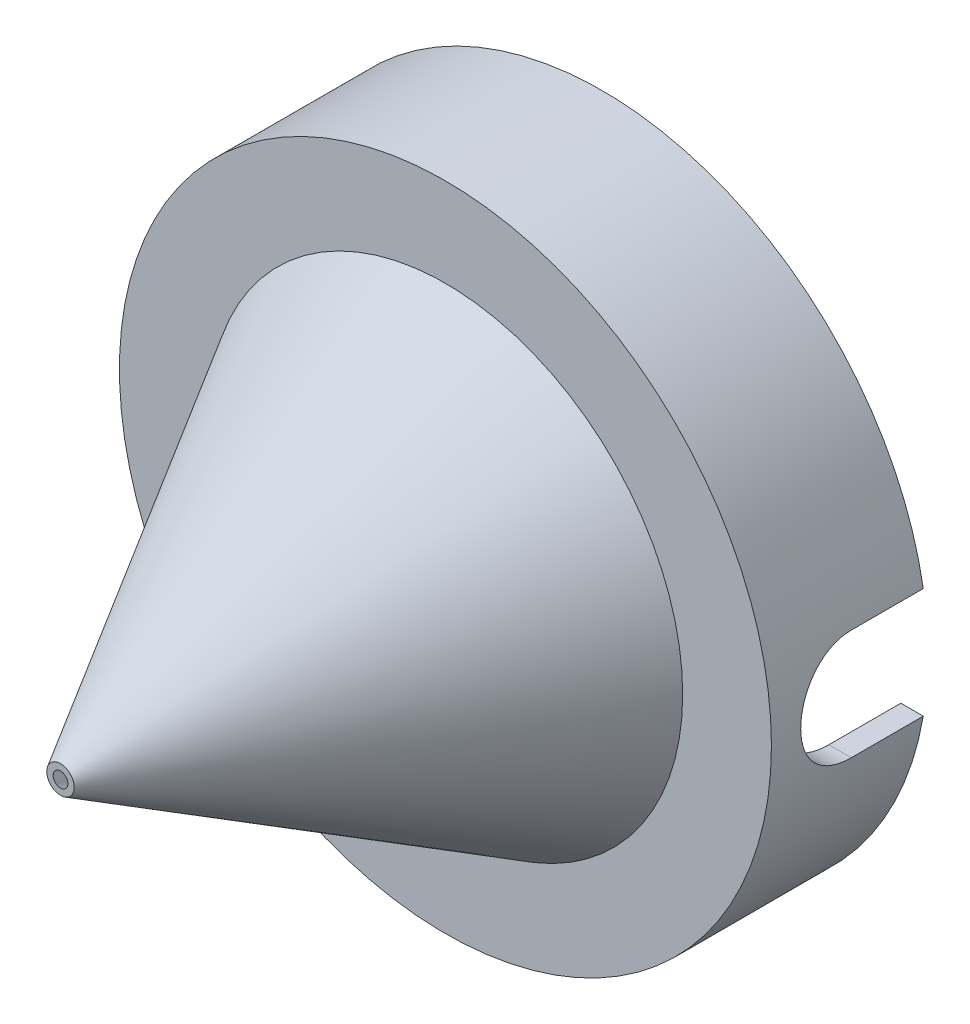
ISO-10303-21;
HEADER;
FILE_DESCRIPTION(('STEP AP214'),'2;1');
FILE_NAME('part.step','',(''),(''),'','','');
FILE_SCHEMA(('AUTOMOTIVE_DESIGN { 1 0 10303 214 1 1 1 1 }'));
ENDSEC;
DATA;
#1=APPLICATION_CONTEXT('core data for automotive mechanical design processes');
#2=APPLICATION_PROTOCOL_DEFINITION('international standard','automotive_design',2000,#1);
#3=PRODUCT_CONTEXT('',#1,'mechanical');
#4=PRODUCT('Part','Part','',(#3));
#5=PRODUCT_RELATED_PRODUCT_CATEGORY('part','',(#4));
#6=PRODUCT_DEFINITION_FORMATION('','',#4);
#7=PRODUCT_DEFINITION_CONTEXT('part definition',#1,'design');
#8=PRODUCT_DEFINITION('design','',#6,#7);
#9=PRODUCT_DEFINITION_SHAPE('','',#8);
#10=(LENGTH_UNIT() NAMED_UNIT(*) SI_UNIT(.MILLI.,.METRE.));
#11=(NAMED_UNIT(*) PLANE_ANGLE_UNIT() SI_UNIT($,.RADIAN.));
#12=(NAMED_UNIT(*) SI_UNIT($,.STERADIAN.) SOLID_ANGLE_UNIT());
#13=UNCERTAINTY_MEASURE_WITH_UNIT(LENGTH_MEASURE(1.E-05),#10,'distance_accuracy_value','');
#14=(GEOMETRIC_REPRESENTATION_CONTEXT(3) GLOBAL_UNCERTAINTY_ASSIGNED_CONTEXT((#13)) GLOBAL_UNIT_ASSIGNED_CONTEXT((#10,
#11,#12)) REPRESENTATION_CONTEXT('',''));
#15=CARTESIAN_POINT('',(0.,0.,0.));
#16=DIRECTION('',(0.,0.,1.));
#17=DIRECTION('',(1.,0.,0.));
#18=AXIS2_PLACEMENT_3D('',#15,#16,#17);
#19=CARTESIAN_POINT('',(20.001,7.5,-9.773));
#20=DIRECTION('',(0.,-1.,0.));
#21=DIRECTION('',(0.,0.,-1.));
#22=AXIS2_PLACEMENT_3D('',#19,#20,#21);
#23=PLANE('',#22);
#24=DIRECTION('',(0.,0.,1.));
#25=VECTOR('',#24,1.);
#26=CARTESIAN_POINT('',(2.60977528031991,7.5,73.4999082568035));
#27=LINE('',#26,#25);
#28=CARTESIAN_POINT('',(2.60977528031991,7.5,9.773));
#29=VERTEX_POINT('',#28);
#30=CARTESIAN_POINT('',(2.60977528031991,7.5,0.));
#31=VERTEX_POINT('',#30);
#32=EDGE_CURVE('E65',#29,#31,#27,.F.);
#33=ORIENTED_EDGE('',*,*,#32,.F.);
#34=DIRECTION('',(-1.,0.,0.));
#35=VECTOR('',#34,1.);
#36=CARTESIAN_POINT('',(20.001,7.5,9.773));
#37=LINE('',#36,#35);
#38=CARTESIAN_POINT('',(-0.437548151030101,7.5,9.773));
#39=VERTEX_POINT('',#38);
#40=EDGE_CURVE('E133',#29,#39,#37,.T.);
#41=ORIENTED_EDGE('',*,*,#40,.T.);
#42=DIRECTION('',(0.,0.,1.));
#43=VECTOR('',#42,1.);
#44=CARTESIAN_POINT('',(-0.437548151030108,7.5,73.4999082568035));
#45=LINE('',#44,#43);
#46=CARTESIAN_POINT('',(-0.437548151030108,7.5,0.));
#47=VERTEX_POINT('',#46);
#48=EDGE_CURVE('E105',#39,#47,#45,.F.);
#49=ORIENTED_EDGE('',*,*,#48,.T.);
#50=DIRECTION('',(-1.,0.,0.));
#51=VECTOR('',#50,1.);
#52=CARTESIAN_POINT('',(20.001,7.5,0.));
#53=LINE('',#52,#51);
#54=EDGE_CURVE('E88',#31,#47,#53,.T.);
#55=ORIENTED_EDGE('',*,*,#54,.F.);
#56=EDGE_LOOP('',(#33,#41,#49,#55));
#57=FACE_BOUND('',#56,.T.);
#58=ADVANCED_FACE('F42',(#57),#23,.T.);
#59=CARTESIAN_POINT('',(20.001,0.,9.773));
#60=DIRECTION('',(-1.,0.,0.));
#61=DIRECTION('',(0.,0.,1.));
#62=AXIS2_PLACEMENT_3D('',#59,#60,#61);
#63=CYLINDRICAL_SURFACE('',#62,7.5);
#64=ORIENTED_EDGE('',*,*,#40,.F.);
#65=CARTESIAN_POINT('',(2.60977528031991,-7.5,9.773));
#66=CARTESIAN_POINT('',(2.60975961998425,-7.50002434988153,9.9823253265746));
#67=CARTESIAN_POINT('',(2.61128187942257,-7.49123763573747,10.1916451057958));
#68=CARTESIAN_POINT('',(2.61728869566765,-7.45621952249872,10.6087569522461));
#69=CARTESIAN_POINT('',(2.62177295057493,-7.42998990125922,10.8165491729883));
#70=CARTESIAN_POINT('',(2.63358263305809,-7.3603083435105,11.2288663255294));
#71=CARTESIAN_POINT('',(2.64090438644108,-7.31687867724245,11.4333951278928));
#72=CARTESIAN_POINT('',(2.65817147227023,-7.2131369536428,11.8380103220212));
#73=CARTESIAN_POINT('',(2.66811680311036,-7.15282490664576,12.0380967165056));
#74=CARTESIAN_POINT('',(2.69034554345818,-7.01576911121261,12.4324279871778));
#75=CARTESIAN_POINT('',(2.70262898670464,-6.93902512566304,12.626672779025));
#76=CARTESIAN_POINT('',(2.72918728671467,-6.76964013154502,13.0080460412062));
#77=CARTESIAN_POINT('',(2.74346287924342,-6.67699324659998,13.1951718496245));
#78=CARTESIAN_POINT('',(2.77359231743402,-6.47652528295688,13.5608871167032));
#79=CARTESIAN_POINT('',(2.78944558882081,-6.36870971978798,13.7394796466943));
#80=CARTESIAN_POINT('',(2.82229637176704,-6.1385949711691,14.0870595491614));
#81=CARTESIAN_POINT('',(2.83929430800001,-6.0162903973414,14.2560433133991));
#82=CARTESIAN_POINT('',(2.87410640729662,-5.75695622885249,14.5846146747969));
#83=CARTESIAN_POINT('',(2.89192635674611,-5.61980846576334,14.7441084019964));
#84=CARTESIAN_POINT('',(2.92774985893826,-5.33256430789778,15.0510637905823));
#85=CARTESIAN_POINT('',(2.94575347722308,-5.182463137247,15.1985209748118));
#86=CARTESIAN_POINT('',(2.98142998233991,-4.87041748833253,15.4802949820959));
#87=CARTESIAN_POINT('',(2.99910293886032,-4.70847554169331,15.6146145997627));
#88=CARTESIAN_POINT('',(3.03363482188589,-4.37376439947405,15.8692628354033));
#89=CARTESIAN_POINT('',(3.05049344584642,-4.2009912337814,15.989586276478));
#90=CARTESIAN_POINT('',(3.08301560862528,-3.84478920121452,16.216011614882));
#91=CARTESIAN_POINT('',(3.09867137864532,-3.66130267293829,16.3220239479762));
#92=CARTESIAN_POINT('',(3.12823105116638,-3.28590451000763,16.5181970655779));
#93=CARTESIAN_POINT('',(3.14213493979633,-3.09399280866048,16.6083577245771));
#94=CARTESIAN_POINT('',(3.16779326676876,-2.70312545914044,16.772143343047));
#95=CARTESIAN_POINT('',(3.17954796646432,-2.50417067096208,16.845770313353));
#96=CARTESIAN_POINT('',(3.20057389026563,-2.100616033069,16.9759412069307));
#97=CARTESIAN_POINT('',(3.20984508252465,-1.89601611100218,17.0324849111399));
#98=CARTESIAN_POINT('',(3.22556065586989,-1.48466665144829,17.1275832524533));
#99=CARTESIAN_POINT('',(3.23203160394501,-1.27795726054199,17.1663071861406));
#100=CARTESIAN_POINT('',(3.24209522015226,-0.861875143332706,17.2262788621048));
#101=CARTESIAN_POINT('',(3.24568689705145,-0.652501525007133,17.2475205859318));
#102=CARTESIAN_POINT('',(3.24988570472254,-0.232727195659477,17.2723356346359));
#103=CARTESIAN_POINT('',(3.25049350514397,-0.0223267256969985,17.2759129238137));
#104=CARTESIAN_POINT('',(3.24870904865884,0.398022534818253,17.2653814267153));
#105=CARTESIAN_POINT('',(3.24631673912147,0.607971317382367,17.2512723301675));
#106=CARTESIAN_POINT('',(3.23863977187095,1.02373814857966,17.2057145205244));
#107=CARTESIAN_POINT('',(3.23338509578374,1.22957647439181,17.1744455225713));
#108=CARTESIAN_POINT('',(3.2201497692274,1.63785615503797,17.0949314717085));
#109=CARTESIAN_POINT('',(3.21216914189717,1.8402975386912,17.0466865628965));
#110=CARTESIAN_POINT('',(3.19370251065286,2.24037120191381,16.9335831668016));
#111=CARTESIAN_POINT('',(3.18321644893782,2.43800337041754,16.8687242962282));
#112=CARTESIAN_POINT('',(3.16002806880285,2.82708429075254,16.7228747269601));
#113=CARTESIAN_POINT('',(3.14732577143813,3.01853310130794,16.6418841815225));
#114=CARTESIAN_POINT('',(3.11998590396587,3.3948661920192,16.4639207782954));
#115=CARTESIAN_POINT('',(3.10533912194524,3.57971355044145,16.36687126607));
#116=CARTESIAN_POINT('',(3.07456819205364,3.94052222350111,16.1578056275569));
#117=CARTESIAN_POINT('',(3.05844456780339,4.11648665355837,16.0457947994623));
#118=CARTESIAN_POINT('',(3.02515171083467,4.45848079392521,15.8075173880692));
#119=CARTESIAN_POINT('',(3.00798206977092,4.62450657357604,15.6812452207737));
#120=CARTESIAN_POINT('',(2.9730803521816,4.94537613757035,15.4153973977027));
#121=CARTESIAN_POINT('',(2.95534847721802,5.10022386546913,15.2758264743698));
#122=CARTESIAN_POINT('',(2.91957519996828,5.39967101732761,14.9824195338276));
#123=CARTESIAN_POINT('',(2.90153274223194,5.54411376403108,14.8284236939054));
#124=CARTESIAN_POINT('',(2.86588016680434,5.81947859293841,14.5088361203435));
#125=CARTESIAN_POINT('',(2.84826989481988,5.950405555509,14.343248608799));
#126=CARTESIAN_POINT('',(2.81396330930552,6.19796345768676,14.0014518826335));
#127=CARTESIAN_POINT('',(2.79726760921388,6.31458486544865,13.8252357014642));
#128=CARTESIAN_POINT('',(2.76528710680848,6.53255534569738,13.4635666595588));
#129=CARTESIAN_POINT('',(2.75000177241728,6.63391018688259,13.2781173231298));
#130=CARTESIAN_POINT('',(2.7212454865725,6.82086231298386,12.8988024609395));
#131=CARTESIAN_POINT('',(2.70777851729532,6.9064251593735,12.704919654678));
#132=CARTESIAN_POINT('',(2.68309740980427,7.06085104958241,12.3105588680912));
#133=CARTESIAN_POINT('',(2.67188240136169,7.12972054637794,12.1100834703393));
#134=CARTESIAN_POINT('',(2.65204095791414,7.25021023017649,11.7041235190424));
#135=CARTESIAN_POINT('',(2.64341179959926,7.30184857087334,11.4986444835582));
#136=CARTESIAN_POINT('',(2.62898623397826,7.38755378163557,11.0840409702899));
#137=CARTESIAN_POINT('',(2.6231884684043,7.42162907743149,10.8749182903889));
#138=CARTESIAN_POINT('',(2.61586495419481,7.46452603220712,10.5166977520177));
#139=CARTESIAN_POINT('',(2.61358290249003,7.47783579312639,10.3681370975348));
#140=CARTESIAN_POINT('',(2.61053760436252,7.4955673608301,10.0707223574219));
#141=CARTESIAN_POINT('',(2.6097718039051,7.50000411379376,9.9218691887179));
#142=CARTESIAN_POINT('',(2.60977528031991,7.5,9.773));
#143=B_SPLINE_CURVE_WITH_KNOTS('',3,(#65,#66,#67,#68,#69,#70,#71,#72,#73,#74,#75,#76,#77,#78,
#79,#80,#81,#82,#83,#84,#85,#86,#87,#88,#89,#90,#91,#92,#93,#94,#95,#96,#97,#98,#99,#100,#101,
#102,#103,#104,#105,#106,#107,#108,#109,#110,#111,#112,#113,#114,#115,#116,#117,#118,#119,#120,
#121,#122,#123,#124,#125,#126,#127,#128,#129,#130,#131,#132,#133,#134,#135,#136,#137,#138,#139,
#140,#141,#142),.UNSPECIFIED.,.F.,.F.,(4,2,2,2,2,2,2,2,2,2,2,2,2,2,2,2,2,2,2,2,2,2,2,2,2,2,2,2,
2,2,2,2,2,2,2,2,2,2,4),(0.,0.627777857118243,1.25549173825551,1.88239551248747,2.50929890296111,
3.13621134028322,3.76335593247338,4.39027307325799,5.01742409709138,5.6499973975711,
6.2828049301969,6.91547755843049,7.54838346016757,8.18508289147385,8.82178736372965,
9.45841435768715,10.0950495149079,10.725504681764,11.3561767993134,11.9867073732697,
12.6172490087545,13.2413096470035,13.8653649881227,14.4894347277351,15.1134985387338,
15.7406320018488,16.3675439665152,16.9947022538336,17.6216381907262,18.2566045848714,
18.891340893316,19.5264978578091,20.1614142134788,20.7976992176461,21.433737866008,
22.0691042915138,22.7041656206711,23.1514276187716,23.5979355876248),.UNSPECIFIED.);
#144=CARTESIAN_POINT('',(2.60977528031991,-7.5,9.773));
#145=VERTEX_POINT('',#144);
#146=EDGE_CURVE('E135',#145,#29,#143,.T.);
#147=ORIENTED_EDGE('',*,*,#146,.F.);
#148=DIRECTION('',(-1.,0.,0.));
#149=VECTOR('',#148,1.);
#150=CARTESIAN_POINT('',(20.001,-7.5,9.773));
#151=LINE('',#150,#149);
#152=CARTESIAN_POINT('',(-0.437548151030108,-7.5,9.773));
#153=VERTEX_POINT('',#152);
#154=EDGE_CURVE('E57',#145,#153,#151,.T.);
#155=ORIENTED_EDGE('',*,*,#154,.T.);
#156=CARTESIAN_POINT('',(-0.437548151030111,7.5,9.773));
#157=CARTESIAN_POINT('',(-0.43756499508304,7.50002454171788,9.98199944469205));
#158=CARTESIAN_POINT('',(-0.435933406243657,7.49126490853373,10.1909929141936));
#159=CARTESIAN_POINT('',(-0.429495524568208,7.45635622331045,10.6074536988751));
#160=CARTESIAN_POINT('',(-0.424689540832032,7.43020886436212,10.8149211606582));
#161=CARTESIAN_POINT('',(-0.412028876993238,7.36072494337881,11.2267304733341));
#162=CARTESIAN_POINT('',(-0.40417607157788,7.31739895087369,11.4310741660547));
#163=CARTESIAN_POINT('',(-0.385656479513373,7.21390184914946,11.8353152032732));
#164=CARTESIAN_POINT('',(-0.374989724726761,7.1537309306661,12.0352125980892));
#165=CARTESIAN_POINT('',(-0.351146434382612,7.01698028534137,12.4292163824157));
#166=CARTESIAN_POINT('',(-0.337969246878964,6.94039629546522,12.6233212524594));
#167=CARTESIAN_POINT('',(-0.309484830923594,6.77139687633272,13.0043502294591));
#168=CARTESIAN_POINT('',(-0.294177560319881,6.67898113377511,13.1912741942194));
#169=CARTESIAN_POINT('',(-0.261879852681244,6.47906643825405,13.5565161483706));
#170=CARTESIAN_POINT('',(-0.244890886169026,6.37158062932619,13.734841457234));
#171=CARTESIAN_POINT('',(-0.209700111306987,6.14226252989118,14.0818132556685));
#172=CARTESIAN_POINT('',(-0.191498498295765,6.02043254759435,14.2504612959905));
#173=CARTESIAN_POINT('',(-0.144550742833021,5.69510681337884,14.6634722502404));
#174=CARTESIAN_POINT('',(-0.115320292629305,5.48250392735661,14.9006914475042));
#175=CARTESIAN_POINT('',(-0.0570500706165545,5.0288722065096,15.3462884971078));
#176=CARTESIAN_POINT('',(-0.0280103295666192,4.78783889956605,15.5546618007395));
#177=CARTESIAN_POINT('',(0.0184249100464838,4.36800426596977,15.8733549404158));
#178=CARTESIAN_POINT('',(0.0364044066465637,4.19613340272426,15.9928275312065));
#179=CARTESIAN_POINT('',(0.0709924087113093,3.84285833741266,16.2170822835179));
#180=CARTESIAN_POINT('',(0.0876006920656537,3.66145259863725,16.3218620669971));
#181=CARTESIAN_POINT('',(0.118985953125722,3.29031785259747,16.515973306904));
#182=CARTESIAN_POINT('',(0.133762201737195,3.10058557203322,16.6052986184772));
#183=CARTESIAN_POINT('',(0.161070345148678,2.71409722930254,16.7678292077507));
#184=CARTESIAN_POINT('',(0.173601432976184,2.51733867205172,16.8410286915468));
#185=CARTESIAN_POINT('',(0.196060347094471,2.11826465847887,16.9707058413272));
#186=CARTESIAN_POINT('',(0.205988464754759,1.91594982691454,17.0271853789891));
#187=CARTESIAN_POINT('',(0.222967724573671,1.50708706203238,17.1230201271345));
#188=CARTESIAN_POINT('',(0.230017561593546,1.30053725287272,17.1623675697104));
#189=CARTESIAN_POINT('',(0.241033601515453,0.884804838162156,17.2235879540029));
#190=CARTESIAN_POINT('',(0.245000140184541,0.675622521809576,17.2454627984691));
#191=CARTESIAN_POINT('',(0.249737081116225,0.256220168588881,17.2715648619981));
#192=CARTESIAN_POINT('',(0.250508965426134,0.0460006582182991,17.2758002642642));
#193=CARTESIAN_POINT('',(0.248846650836579,-0.372078391922263,17.2666552212221));
#194=CARTESIAN_POINT('',(0.246442284377285,-0.579941657263327,17.2534386909716));
#195=CARTESIAN_POINT('',(0.238547861583322,-0.993716700318653,17.2097862312413));
#196=CARTESIAN_POINT('',(0.233058927046292,-1.19962915983507,17.1793565618201));
#197=CARTESIAN_POINT('',(0.219149710046218,-1.60809071446532,17.1015241335822));
#198=CARTESIAN_POINT('',(0.210729789100076,-1.81064022114955,17.0541234679999));
#199=CARTESIAN_POINT('',(0.1911914224161,-2.2109739637026,16.9427110874497));
#200=CARTESIAN_POINT('',(0.180073168164518,-2.40875853661888,16.8787005511729));
#201=CARTESIAN_POINT('',(0.156822232788887,-2.77642481876806,16.742611516855));
#202=CARTESIAN_POINT('',(0.144941732898436,-2.94695484999626,16.6722338121714));
#203=CARTESIAN_POINT('',(0.119548088018915,-3.28230790772296,16.519142162703));
#204=CARTESIAN_POINT('',(0.106034586874254,-3.44712967913553,16.4364255258865));
#205=CARTESIAN_POINT('',(0.0776686800268598,-3.77013554653574,16.2591403476486));
#206=CARTESIAN_POINT('',(0.0628163626608422,-3.92832007944861,16.1645725880182));
#207=CARTESIAN_POINT('',(0.0320900449592047,-4.2372381945373,15.964100342437));
#208=CARTESIAN_POINT('',(0.0162159752808814,-4.38797126977917,15.8581950867265));
#209=CARTESIAN_POINT('',(-0.0186017564732587,-4.70277853228948,15.61923396036));
#210=CARTESIAN_POINT('',(-0.0376534253631424,-4.86555278669823,15.4844759572659));
#211=CARTESIAN_POINT('',(-0.0761198094602989,-5.17914064643513,15.2017275343992));
#212=CARTESIAN_POINT('',(-0.0955345570248062,-5.32995317940798,15.053735930773));
#213=CARTESIAN_POINT('',(-0.134186474591974,-5.61863017556996,14.745484174387));
#214=CARTESIAN_POINT('',(-0.153423570084394,-5.75648941017237,14.5852191144317));
#215=CARTESIAN_POINT('',(-0.191165952522745,-6.01822671270579,14.2535770323483));
#216=CARTESIAN_POINT('',(-0.209671254878601,-6.14210507514459,14.0822002444092));
#217=CARTESIAN_POINT('',(-0.245432607399679,-6.37507966830515,13.7293962926055));
#218=CARTESIAN_POINT('',(-0.262687870185902,-6.48416661922688,13.5479629190879));
#219=CARTESIAN_POINT('',(-0.295431534841816,-6.68663765223525,13.1764710915699));
#220=CARTESIAN_POINT('',(-0.310920576113869,-6.78002742281023,12.9864157939062));
#221=CARTESIAN_POINT('',(-0.339681536965489,-6.9504300869825,12.5989994581812));
#222=CARTESIAN_POINT('',(-0.352954181055324,-7.02744833446505,12.4016408333507));
#223=CARTESIAN_POINT('',(-0.376894486936597,-7.16453892892584,12.001055317353));
#224=CARTESIAN_POINT('',(-0.387562685614824,-7.22461476885061,11.797829645309));
#225=CARTESIAN_POINT('',(-0.410074459258292,-7.35025735725406,11.2952677277196));
#226=CARTESIAN_POINT('',(-0.420328157233884,-7.40636902692401,10.9934096005943));
#227=CARTESIAN_POINT('',(-0.430631852841679,-7.46251766689258,10.5374205238896));
#228=CARTESIAN_POINT('',(-0.433220265563044,-7.47656405962381,10.3849218655319));
#229=CARTESIAN_POINT('',(-0.436679715695785,-7.49530526048664,10.0792987246132));
#230=CARTESIAN_POINT('',(-0.437550384549332,-7.49999806172092,9.92617411480933));
#231=CARTESIAN_POINT('',(-0.437548151030101,-7.5,9.773));
#232=B_SPLINE_CURVE_WITH_KNOTS('',3,(#156,#157,#158,#159,#160,#161,#162,#163,#164,#165,#166,
#167,#168,#169,#170,#171,#172,#173,#174,#175,#176,#177,#178,#179,#180,#181,#182,#183,#184,#185,
#186,#187,#188,#189,#190,#191,#192,#193,#194,#195,#196,#197,#198,#199,#200,#201,#202,#203,#204,
#205,#206,#207,#208,#209,#210,#211,#212,#213,#214,#215,#216,#217,#218,#219,#220,#221,#222,#223,
#224,#225,#226,#227,#228,#229,#230,#231),.UNSPECIFIED.,.F.,.F.,(4,2,2,2,2,2,2,2,2,2,2,2,2,2,2,2,
2,2,2,2,2,2,2,2,2,2,2,2,2,2,2,2,2,2,2,2,2,4),(0.,0.626799507648492,1.25353799103598,
1.87989145677038,2.50623783056713,3.13274708548118,3.7592687400842,4.38524730627824,
5.01112527967684,5.96810640173354,6.92523825863328,7.55482986426072,8.18452325241952,
8.81446644050494,9.44463559524494,10.0747341803922,10.7051181634114,11.3354334888393,
11.9654563688847,12.589603726171,13.213524239921,13.8373678246429,14.4611671514676,
15.0152616138955,15.569477142504,16.1236561300298,16.6778727674533,17.3136287268829,
17.9494416168724,18.5855100594104,19.221565100632,19.8580173601929,20.4942384767307,
21.1302512123426,21.7661327278054,22.6850082219088,23.1442591561212,23.6036086161558),.UNSPECIFIED.);
#233=EDGE_CURVE('E100',#39,#153,#232,.T.);
#234=ORIENTED_EDGE('',*,*,#233,.F.);
#235=EDGE_LOOP('',(#64,#147,#155,#234));
#236=FACE_BOUND('',#235,.T.);
#237=ADVANCED_FACE('F116',(#236),#63,.F.);
#238=CARTESIAN_POINT('',(20.001,-7.5,-9.773));
#239=DIRECTION('',(0.,1.,0.));
#240=DIRECTION('',(0.,0.,1.));
#241=AXIS2_PLACEMENT_3D('',#238,#239,#240);
#242=PLANE('',#241);
#243=ORIENTED_EDGE('',*,*,#154,.F.);
#244=DIRECTION('',(0.,0.,1.));
#245=VECTOR('',#244,1.);
#246=CARTESIAN_POINT('',(2.60977528031991,-7.5,73.4999082568035));
#247=LINE('',#246,#245);
#248=CARTESIAN_POINT('',(2.60977528031991,-7.5,0.));
#249=VERTEX_POINT('',#248);
#250=EDGE_CURVE('E94',#249,#145,#247,.T.);
#251=ORIENTED_EDGE('',*,*,#250,.F.);
#252=DIRECTION('',(1.,0.,0.));
#253=VECTOR('',#252,1.);
#254=CARTESIAN_POINT('',(20.001,-7.5,0.));
#255=LINE('',#254,#253);
#256=CARTESIAN_POINT('',(-0.437548151030108,-7.5,0.));
#257=VERTEX_POINT('',#256);
#258=EDGE_CURVE('E87',#257,#249,#255,.T.);
#259=ORIENTED_EDGE('',*,*,#258,.F.);
#260=DIRECTION('',(0.,0.,1.));
#261=VECTOR('',#260,1.);
#262=CARTESIAN_POINT('',(-0.437548151030108,-7.5,73.4999082568035));
#263=LINE('',#262,#261);
#264=EDGE_CURVE('E97',#257,#153,#263,.T.);
#265=ORIENTED_EDGE('',*,*,#264,.T.);
#266=EDGE_LOOP('',(#243,#251,#259,#265));
#267=FACE_BOUND('',#266,.T.);
#268=ADVANCED_FACE('F96',(#267),#242,.T.);
#269=CARTESIAN_POINT('',(-85.25,0.,0.));
#270=DIRECTION('',(0.,0.,1.));
#271=DIRECTION('',(1.,0.,0.));
#272=AXIS2_PLACEMENT_3D('',#269,#270,#271);
#273=PLANE('',#272);
#274=CARTESIAN_POINT('',(-41.,0.,0.));
#275=DIRECTION('',(0.,0.,1.));
#276=DIRECTION('',(1.,0.,0.));
#277=AXIS2_PLACEMENT_3D('',#274,#275,#276);
#278=CIRCLE('',#277,41.25);
#279=EDGE_CURVE('E84',#47,#257,#278,.T.);
#280=ORIENTED_EDGE('',*,*,#279,.T.);
#281=ORIENTED_EDGE('',*,*,#258,.T.);
#282=CARTESIAN_POINT('',(-41.,0.,0.));
#283=DIRECTION('',(0.,0.,1.));
#284=DIRECTION('',(1.,0.,0.));
#285=AXIS2_PLACEMENT_3D('',#282,#283,#284);
#286=CIRCLE('',#285,44.25);
#287=EDGE_CURVE('E12',#31,#249,#286,.T.);
#288=ORIENTED_EDGE('',*,*,#287,.F.);
#289=ORIENTED_EDGE('',*,*,#54,.T.);
#290=EDGE_LOOP('',(#280,#281,#288,#289));
#291=FACE_BOUND('',#290,.T.);
#292=ADVANCED_FACE('F86',(#291),#273,.F.);
#293=CARTESIAN_POINT('',(-41.,0.,73.4999082568035));
#294=DIRECTION('',(0.,0.,1.));
#295=DIRECTION('',(1.,0.,0.));
#296=AXIS2_PLACEMENT_3D('',#293,#294,#295);
#297=CYLINDRICAL_SURFACE('',#296,41.25);
#298=ORIENTED_EDGE('',*,*,#279,.F.);
#299=ORIENTED_EDGE('',*,*,#48,.F.);
#300=ORIENTED_EDGE('',*,*,#233,.T.);
#301=ORIENTED_EDGE('',*,*,#264,.F.);
#302=EDGE_LOOP('',(#298,#299,#300,#301));
#303=FACE_BOUND('',#302,.T.);
#304=CARTESIAN_POINT('',(-41.,0.,19.25));
#305=DIRECTION('',(0.,0.,1.));
#306=DIRECTION('',(1.,0.,0.));
#307=AXIS2_PLACEMENT_3D('',#304,#305,#306);
#308=CIRCLE('',#307,41.25);
#309=CARTESIAN_POINT('',(0.250000000000014,0.,19.25));
#310=VERTEX_POINT('',#309);
#311=EDGE_CURVE('E93',#310,#310,#308,.T.);
#312=ORIENTED_EDGE('',*,*,#311,.T.);
#313=EDGE_LOOP('',(#312));
#314=FACE_BOUND('',#313,.T.);
#315=ADVANCED_FACE('F102',(#303,#314),#297,.F.);
#316=CARTESIAN_POINT('',(-41.,0.,73.4999082568035));
#317=DIRECTION('',(0.,0.,1.));
#318=DIRECTION('',(1.,0.,0.));
#319=AXIS2_PLACEMENT_3D('',#316,#317,#318);
#320=CYLINDRICAL_SURFACE('',#319,44.25);
#321=CARTESIAN_POINT('',(-41.,0.,21.25));
#322=DIRECTION('',(0.,0.,1.));
#323=DIRECTION('',(1.,0.,0.));
#324=AXIS2_PLACEMENT_3D('',#321,#322,#323);
#325=CIRCLE('',#324,44.25);
#326=CARTESIAN_POINT('',(3.25000000000002,0.,21.25));
#327=VERTEX_POINT('',#326);
#328=EDGE_CURVE('E50',#327,#327,#325,.T.);
#329=ORIENTED_EDGE('',*,*,#328,.F.);
#330=EDGE_LOOP('',(#329));
#331=FACE_BOUND('',#330,.T.);
#332=ORIENTED_EDGE('',*,*,#32,.T.);
#333=ORIENTED_EDGE('',*,*,#287,.T.);
#334=ORIENTED_EDGE('',*,*,#250,.T.);
#335=ORIENTED_EDGE('',*,*,#146,.T.);
#336=EDGE_LOOP('',(#332,#333,#334,#335));
#337=FACE_BOUND('',#336,.T.);
#338=ADVANCED_FACE('F138',(#331,#337),#320,.T.);
#339=CARTESIAN_POINT('',(-73.5,0.,19.25));
#340=DIRECTION('',(0.,0.,1.));
#341=DIRECTION('',(1.,0.,0.));
#342=AXIS2_PLACEMENT_3D('',#339,#340,#341);
#343=PLANE('',#342);
#344=ORIENTED_EDGE('',*,*,#311,.F.);
#345=EDGE_LOOP('',(#344));
#346=FACE_BOUND('',#345,.T.);
#347=CARTESIAN_POINT('',(-41.,0.,19.25));
#348=DIRECTION('',(0.,0.,1.));
#349=DIRECTION('',(1.,0.,0.));
#350=AXIS2_PLACEMENT_3D('',#347,#348,#349);
#351=CIRCLE('',#350,32.5);
#352=CARTESIAN_POINT('',(-73.5,0.,19.25));
#353=VERTEX_POINT('',#352);
#354=EDGE_CURVE('E150',#353,#353,#351,.T.);
#355=ORIENTED_EDGE('',*,*,#354,.T.);
#356=EDGE_LOOP('',(#355));
#357=FACE_BOUND('',#356,.T.);
#358=ADVANCED_FACE('F166',(#346,#357),#343,.F.);
#359=CARTESIAN_POINT('',(-41.,0.,73.4999082568035));
#360=DIRECTION('',(0.,0.,-1.));
#361=DIRECTION('',(-1.,0.,0.));
#362=AXIS2_PLACEMENT_3D('',#359,#360,#361);
#363=CONICAL_SURFACE('',#362,1.,0.526067153351238);
#364=CARTESIAN_POINT('',(-41.,0.,73.4999082568035));
#365=DIRECTION('',(0.,0.,1.));
#366=DIRECTION('',(1.,0.,0.));
#367=AXIS2_PLACEMENT_3D('',#364,#365,#366);
#368=CIRCLE('',#367,1.);
#369=CARTESIAN_POINT('',(-42.,0.,73.4999082568035));
#370=VERTEX_POINT('',#369);
#371=EDGE_CURVE('E153',#370,#370,#368,.T.);
#372=CARTESIAN_POINT('',(-73.5,0.,19.25));
#373=CARTESIAN_POINT('',(-73.171875,0.,19.8151032110084));
#374=CARTESIAN_POINT('',(-72.84375,0.,20.3802064220167));
#375=CARTESIAN_POINT('',(-72.1875,0.,21.5104128440335));
#376=CARTESIAN_POINT('',(-71.859375,0.,22.0755160550419));
#377=CARTESIAN_POINT('',(-71.203125,0.,23.2057224770586));
#378=CARTESIAN_POINT('',(-70.875,0.,23.770825688067));
#379=CARTESIAN_POINT('',(-70.21875,0.,24.9010321100837));
#380=CARTESIAN_POINT('',(-69.890625,0.,25.4661353210921));
#381=CARTESIAN_POINT('',(-69.234375,0.,26.5963417431088));
#382=CARTESIAN_POINT('',(-68.90625,0.,27.1614449541172));
#383=CARTESIAN_POINT('',(-68.25,0.,28.2916513761339));
#384=CARTESIAN_POINT('',(-67.921875,0.,28.8567545871423));
#385=CARTESIAN_POINT('',(-67.265625,0.,29.986961009159));
#386=CARTESIAN_POINT('',(-66.9375,0.,30.5520642201674));
#387=CARTESIAN_POINT('',(-66.28125,0.,31.6822706421841));
#388=CARTESIAN_POINT('',(-65.953125,0.,32.2473738531925));
#389=CARTESIAN_POINT('',(-65.296875,0.,33.3775802752092));
#390=CARTESIAN_POINT('',(-64.96875,0.,33.9426834862176));
#391=CARTESIAN_POINT('',(-64.3125,0.,35.0728899082344));
#392=CARTESIAN_POINT('',(-63.984375,0.,35.6379931192427));
#393=CARTESIAN_POINT('',(-63.328125,0.,36.7681995412595));
#394=CARTESIAN_POINT('',(-63.,0.,37.3333027522678));
#395=CARTESIAN_POINT('',(-62.34375,0.,38.4635091742846));
#396=CARTESIAN_POINT('',(-62.015625,0.,39.028612385293));
#397=CARTESIAN_POINT('',(-61.359375,0.,40.1588188073097));
#398=CARTESIAN_POINT('',(-61.03125,0.,40.7239220183181));
#399=CARTESIAN_POINT('',(-60.375,0.,41.8541284403348));
#400=CARTESIAN_POINT('',(-60.046875,0.,42.4192316513432));
#401=CARTESIAN_POINT('',(-59.390625,0.,43.5494380733599));
#402=CARTESIAN_POINT('',(-59.0625,0.,44.1145412843683));
#403=CARTESIAN_POINT('',(-58.40625,0.,45.244747706385));
#404=CARTESIAN_POINT('',(-58.078125,0.,45.8098509173934));
#405=CARTESIAN_POINT('',(-57.421875,0.,46.9400573394101));
#406=CARTESIAN_POINT('',(-57.09375,0.,47.5051605504185));
#407=CARTESIAN_POINT('',(-56.4375,0.,48.6353669724352));
#408=CARTESIAN_POINT('',(-56.109375,0.,49.2004701834436));
#409=CARTESIAN_POINT('',(-55.453125,0.,50.3306766054603));
#410=CARTESIAN_POINT('',(-55.125,0.,50.8957798164687));
#411=CARTESIAN_POINT('',(-54.46875,0.,52.0259862384855));
#412=CARTESIAN_POINT('',(-54.140625,0.,52.5910894494938));
#413=CARTESIAN_POINT('',(-53.484375,0.,53.7212958715106));
#414=CARTESIAN_POINT('',(-53.15625,0.,54.2863990825189));
#415=CARTESIAN_POINT('',(-52.5,0.,55.4166055045357));
#416=CARTESIAN_POINT('',(-52.171875,0.,55.9817087155441));
#417=CARTESIAN_POINT('',(-51.515625,0.,57.1119151375608));
#418=CARTESIAN_POINT('',(-51.1875,0.,57.6770183485692));
#419=CARTESIAN_POINT('',(-50.53125,0.,58.8072247705859));
#420=CARTESIAN_POINT('',(-50.203125,0.,59.3723279815943));
#421=CARTESIAN_POINT('',(-49.546875,0.,60.502534403611));
#422=CARTESIAN_POINT('',(-49.21875,0.,61.0676376146194));
#423=CARTESIAN_POINT('',(-48.5625,0.,62.1978440366361));
#424=CARTESIAN_POINT('',(-48.234375,0.,62.7629472476445));
#425=CARTESIAN_POINT('',(-47.578125,0.,63.8931536696612));
#426=CARTESIAN_POINT('',(-47.25,0.,64.4582568806696));
#427=CARTESIAN_POINT('',(-46.59375,0.,65.5884633026863));
#428=CARTESIAN_POINT('',(-46.265625,0.,66.1535665136947));
#429=CARTESIAN_POINT('',(-45.609375,0.,67.2837729357115));
#430=CARTESIAN_POINT('',(-45.28125,0.,67.8488761467198));
#431=CARTESIAN_POINT('',(-44.625,0.,68.9790825687366));
#432=CARTESIAN_POINT('',(-44.296875,0.,69.5441857797449));
#433=CARTESIAN_POINT('',(-43.640625,0.,70.6743922017617));
#434=CARTESIAN_POINT('',(-43.3125,0.,71.23949541277));
#435=CARTESIAN_POINT('',(-42.65625,0.,72.3697018347868));
#436=CARTESIAN_POINT('',(-42.328125,0.,72.9348050457951));
#437=CARTESIAN_POINT('',(-42.,0.,73.4999082568035));
#438=B_SPLINE_CURVE_WITH_KNOTS('',3,(#372,#373,#374,#375,#376,#377,#378,#379,#380,#381,#382,
#383,#384,#385,#386,#387,#388,#389,#390,#391,#392,#393,#394,#395,#396,#397,#398,#399,#400,#401,
#402,#403,#404,#405,#406,#407,#408,#409,#410,#411,#412,#413,#414,#415,#416,#417,#418,#419,#420,
#421,#422,#423,#424,#425,#426,#427,#428,#429,#430,#431,#432,#433,#434,#435,#436,#437),
.UNSPECIFIED.,.F.,.F.,(4,2,2,2,2,2,2,2,2,2,2,2,2,2,2,2,2,2,2,2,2,2,2,2,2,2,2,2,2,2,2,2,4),(0.,
1.9603746816496,3.92074936329918,5.88112404494877,7.84149872659837,9.80187340824796,
11.7622480898975,13.7226227715471,15.6829974531967,17.6433721348463,19.6037468164959,
21.5641214981455,23.5244961797951,25.4848708614447,27.4452455430943,29.4056202247438,
31.3659949063934,33.326369588043,35.2867442696926,37.2471189513422,39.2074936329918,
41.1678683146414,43.128242996291,45.0886176779406,47.0489923595902,49.0093670412398,
50.9697417228894,52.9301164045389,54.8904910861885,56.8508657678381,58.8112404494877,
60.7716151311373,62.7319898127869),.UNSPECIFIED.);
#439=EDGE_CURVE('BSEAM171',#353,#370,#438,.T.);
#440=ORIENTED_EDGE('',*,*,#354,.F.);
#441=ORIENTED_EDGE('',*,*,#371,.T.);
#442=ORIENTED_EDGE('',*,*,#439,.T.);
#443=ORIENTED_EDGE('',*,*,#439,.F.);
#444=EDGE_LOOP('',(#440,#442,#441,#443));
#445=FACE_BOUND('',#444,.T.);
#446=ADVANCED_FACE('F171',(#445),#363,.F.);
#447=CARTESIAN_POINT('',(-42.,0.,73.4999082568035));
#448=DIRECTION('',(0.,0.,-1.));
#449=DIRECTION('',(-1.,0.,0.));
#450=AXIS2_PLACEMENT_3D('',#447,#448,#449);
#451=PLANE('',#450);
#452=ORIENTED_EDGE('',*,*,#371,.F.);
#453=EDGE_LOOP('',(#452));
#454=FACE_BOUND('',#453,.T.);
#455=CARTESIAN_POINT('',(-41.,0.,73.4999082568035));
#456=DIRECTION('',(0.,0.,1.));
#457=DIRECTION('',(1.,0.,0.));
#458=AXIS2_PLACEMENT_3D('',#455,#456,#457);
#459=CIRCLE('',#458,1.86726399862048);
#460=CARTESIAN_POINT('',(-42.8672639986205,0.,73.4999082568035));
#461=VERTEX_POINT('',#460);
#462=EDGE_CURVE('E156',#461,#461,#459,.T.);
#463=ORIENTED_EDGE('',*,*,#462,.T.);
#464=EDGE_LOOP('',(#463));
#465=FACE_BOUND('',#464,.T.);
#466=ADVANCED_FACE('F179',(#454,#465),#451,.F.);
#467=CARTESIAN_POINT('',(-41.,0.,21.25));
#468=DIRECTION('',(0.,0.,-1.));
#469=DIRECTION('',(-1.,0.,0.));
#470=AXIS2_PLACEMENT_3D('',#467,#468,#469);
#471=CONICAL_SURFACE('',#470,32.2059717121566,0.526067153351238);
#472=CARTESIAN_POINT('',(-41.,0.,21.25));
#473=DIRECTION('',(0.,0.,1.));
#474=DIRECTION('',(1.,0.,0.));
#475=AXIS2_PLACEMENT_3D('',#472,#473,#474);
#476=CIRCLE('',#475,32.2059717121566);
#477=CARTESIAN_POINT('',(-73.2059717121566,0.,21.25));
#478=VERTEX_POINT('',#477);
#479=EDGE_CURVE('E159',#478,#478,#476,.T.);
#480=CARTESIAN_POINT('',(-42.8672639986205,0.,73.4999082568035));
#481=CARTESIAN_POINT('',(-43.1832922039698,0.,72.9556383791285));
#482=CARTESIAN_POINT('',(-43.4993204093192,0.,72.4113685014534));
#483=CARTESIAN_POINT('',(-44.1313768200178,0.,71.3228287461034));
#484=CARTESIAN_POINT('',(-44.4474050253672,0.,70.7785588684283));
#485=CARTESIAN_POINT('',(-45.0794614360658,0.,69.6900191130783));
#486=CARTESIAN_POINT('',(-45.3954896414152,0.,69.1457492354032));
#487=CARTESIAN_POINT('',(-46.0275460521138,0.,68.0572094800531));
#488=CARTESIAN_POINT('',(-46.3435742574632,0.,67.5129396023781));
#489=CARTESIAN_POINT('',(-46.9756306681618,0.,66.424399847028));
#490=CARTESIAN_POINT('',(-47.2916588735112,0.,65.880129969353));
#491=CARTESIAN_POINT('',(-47.9237152842098,0.,64.7915902140029));
#492=CARTESIAN_POINT('',(-48.2397434895592,0.,64.2473203363279));
#493=CARTESIAN_POINT('',(-48.8717999002578,0.,63.1587805809778));
#494=CARTESIAN_POINT('',(-49.1878281056072,0.,62.6145107033028));
#495=CARTESIAN_POINT('',(-49.8198845163058,0.,61.5259709479527));
#496=CARTESIAN_POINT('',(-50.1359127216552,0.,60.9817010702777));
#497=CARTESIAN_POINT('',(-50.7679691323539,0.,59.8931613149276));
#498=CARTESIAN_POINT('',(-51.0839973377032,0.,59.3488914372526));
#499=CARTESIAN_POINT('',(-51.7160537484019,0.,58.2603516819025));
#500=CARTESIAN_POINT('',(-52.0320819537512,0.,57.7160818042274));
#501=CARTESIAN_POINT('',(-52.6641383644499,0.,56.6275420488774));
#502=CARTESIAN_POINT('',(-52.9801665697992,0.,56.0832721712023));
#503=CARTESIAN_POINT('',(-53.6122229804979,0.,54.9947324158523));
#504=CARTESIAN_POINT('',(-53.9282511858472,0.,54.4504625381772));
#505=CARTESIAN_POINT('',(-54.5603075965459,0.,53.3619227828272));
#506=CARTESIAN_POINT('',(-54.8763358018952,0.,52.8176529051521));
#507=CARTESIAN_POINT('',(-55.5083922125939,0.,51.729113149802));
#508=CARTESIAN_POINT('',(-55.8244204179432,0.,51.184843272127));
#509=CARTESIAN_POINT('',(-56.4564768286419,0.,50.0963035167769));
#510=CARTESIAN_POINT('',(-56.7725050339912,0.,49.5520336391019));
#511=CARTESIAN_POINT('',(-57.4045614446899,0.,48.4634938837518));
#512=CARTESIAN_POINT('',(-57.7205896500392,0.,47.9192240060768));
#513=CARTESIAN_POINT('',(-58.3526460607379,0.,46.8306842507267));
#514=CARTESIAN_POINT('',(-58.6686742660872,0.,46.2864143730517));
#515=CARTESIAN_POINT('',(-59.3007306767859,0.,45.1978746177016));
#516=CARTESIAN_POINT('',(-59.6167588821352,0.,44.6536047400266));
#517=CARTESIAN_POINT('',(-60.2488152928339,0.,43.5650649846765));
#518=CARTESIAN_POINT('',(-60.5648434981832,0.,43.0207951070015));
#519=CARTESIAN_POINT('',(-61.1968999088819,0.,41.9322553516514));
#520=CARTESIAN_POINT('',(-61.5129281142312,0.,41.3879854739764));
#521=CARTESIAN_POINT('',(-62.1449845249299,0.,40.2994457186263));
#522=CARTESIAN_POINT('',(-62.4610127302792,0.,39.7551758409513));
#523=CARTESIAN_POINT('',(-63.0930691409779,0.,38.6666360856012));
#524=CARTESIAN_POINT('',(-63.4090973463272,0.,38.1223662079261));
#525=CARTESIAN_POINT('',(-64.0411537570259,0.,37.0338264525761));
#526=CARTESIAN_POINT('',(-64.3571819623752,0.,36.489556574901));
#527=CARTESIAN_POINT('',(-64.9892383730739,0.,35.401016819551));
#528=CARTESIAN_POINT('',(-65.3052665784232,0.,34.8567469418759));
#529=CARTESIAN_POINT('',(-65.9373229891219,0.,33.7682071865258));
#530=CARTESIAN_POINT('',(-66.2533511944713,0.,33.2239373088508));
#531=CARTESIAN_POINT('',(-66.8854076051699,0.,32.1353975535007));
#532=CARTESIAN_POINT('',(-67.2014358105192,0.,31.5911276758257));
#533=CARTESIAN_POINT('',(-67.8334922212179,0.,30.5025879204756));
#534=CARTESIAN_POINT('',(-68.1495204265672,0.,29.9583180428006));
#535=CARTESIAN_POINT('',(-68.7815768372659,0.,28.8697782874505));
#536=CARTESIAN_POINT('',(-69.0976050426153,0.,28.3255084097755));
#537=CARTESIAN_POINT('',(-69.7296614533139,0.,27.2369686544254));
#538=CARTESIAN_POINT('',(-70.0456896586632,0.,26.6926987767504));
#539=CARTESIAN_POINT('',(-70.6777460693619,0.,25.6041590214003));
#540=CARTESIAN_POINT('',(-70.9937742747112,0.,25.0598891437253));
#541=CARTESIAN_POINT('',(-71.6258306854099,0.,23.9713493883752));
#542=CARTESIAN_POINT('',(-71.9418588907592,0.,23.4270795107002));
#543=CARTESIAN_POINT('',(-72.5739153014579,0.,22.3385397553501));
#544=CARTESIAN_POINT('',(-72.8899435068073,0.,21.794269877675));
#545=CARTESIAN_POINT('',(-73.2059717121566,0.,21.25));
#546=B_SPLINE_CURVE_WITH_KNOTS('',3,(#480,#481,#482,#483,#484,#485,#486,#487,#488,#489,#490,
#491,#492,#493,#494,#495,#496,#497,#498,#499,#500,#501,#502,#503,#504,#505,#506,#507,#508,#509,
#510,#511,#512,#513,#514,#515,#516,#517,#518,#519,#520,#521,#522,#523,#524,#525,#526,#527,#528,
#529,#530,#531,#532,#533,#534,#535,#536,#537,#538,#539,#540,#541,#542,#543,#544,#545),
.UNSPECIFIED.,.F.,.F.,(4,2,2,2,2,2,2,2,2,2,2,2,2,2,2,2,2,2,2,2,2,2,2,2,2,2,2,2,2,2,2,2,4),(0.,
1.88810268176454,3.7762053635291,5.66430804529366,7.5524107270582,9.44051340882274,
11.3286160905873,13.2167187723518,15.1048214541164,16.9929241358809,18.8810268176455,
20.76912949941,22.6572321811746,24.5453348629391,26.4334375447037,28.3215402264682,
30.2096429082328,32.0977455899973,33.9858482717619,35.8739509535264,37.762053635291,
39.6501563170555,41.5382589988201,43.4263616805846,45.3144643623492,47.2025670441137,
49.0906697258783,50.9787724076428,52.8668750894074,54.7549777711719,56.6430804529365,
58.531183134701,60.4192858164656),.UNSPECIFIED.);
#547=EDGE_CURVE('BSEAM176',#461,#478,#546,.T.);
#548=ORIENTED_EDGE('',*,*,#462,.F.);
#549=ORIENTED_EDGE('',*,*,#479,.T.);
#550=ORIENTED_EDGE('',*,*,#547,.T.);
#551=ORIENTED_EDGE('',*,*,#547,.F.);
#552=EDGE_LOOP('',(#548,#550,#549,#551));
#553=FACE_BOUND('',#552,.T.);
#554=ADVANCED_FACE('F176',(#553),#471,.T.);
#555=CARTESIAN_POINT('',(-73.2059717121566,0.,21.25));
#556=DIRECTION('',(0.,0.,-1.));
#557=DIRECTION('',(-1.,0.,0.));
#558=AXIS2_PLACEMENT_3D('',#555,#556,#557);
#559=PLANE('',#558);
#560=ORIENTED_EDGE('',*,*,#479,.F.);
#561=EDGE_LOOP('',(#560));
#562=FACE_BOUND('',#561,.T.);
#563=ORIENTED_EDGE('',*,*,#328,.T.);
#564=EDGE_LOOP('',(#563));
#565=FACE_BOUND('',#564,.T.);
#566=ADVANCED_FACE('F44',(#562,#565),#559,.F.);
#567=CLOSED_SHELL('',(#58,#237,#268,#292,#315,#338,#358,#446,#466,#554,#566));
#568=MANIFOLD_SOLID_BREP('B2',#567);
#569=ADVANCED_BREP_SHAPE_REPRESENTATION('',(#18,#568),#14);
#570=SHAPE_DEFINITION_REPRESENTATION(#9,#569);
ENDSEC;
END-ISO-10303-21;
